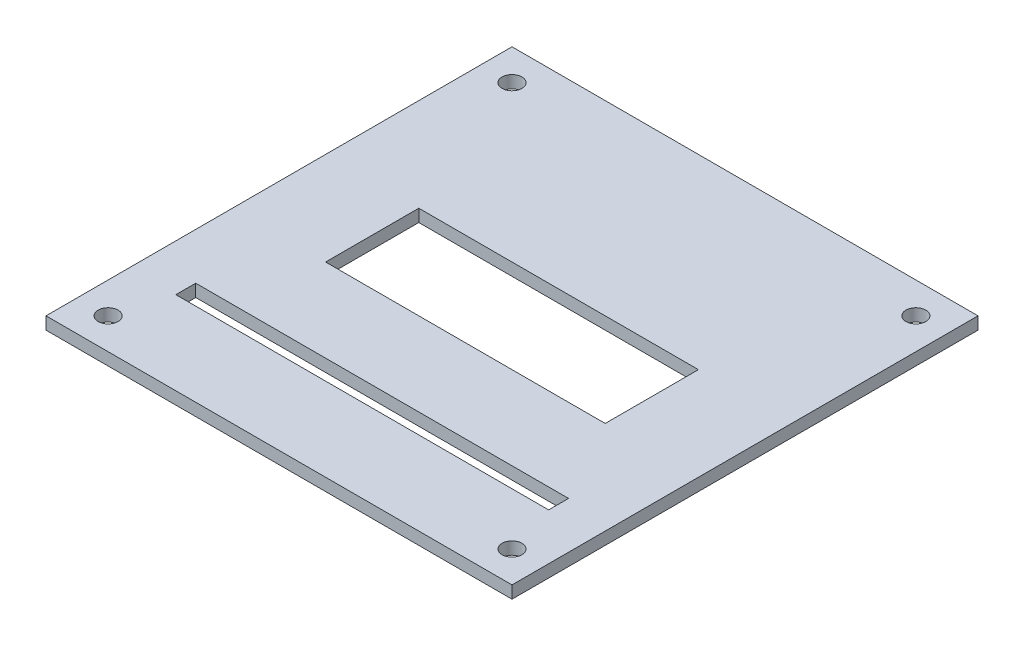
ISO-10303-21;
HEADER;
FILE_DESCRIPTION(('STEP AP214'),'2;1');
FILE_NAME('part.step','',(''),(''),'','','');
FILE_SCHEMA(('AUTOMOTIVE_DESIGN { 1 0 10303 214 1 1 1 1 }'));
ENDSEC;
DATA;
#1=APPLICATION_CONTEXT('core data for automotive mechanical design processes');
#2=APPLICATION_PROTOCOL_DEFINITION('international standard','automotive_design',2000,#1);
#3=PRODUCT_CONTEXT('',#1,'mechanical');
#4=PRODUCT('Part','Part','',(#3));
#5=PRODUCT_RELATED_PRODUCT_CATEGORY('part','',(#4));
#6=PRODUCT_DEFINITION_FORMATION('','',#4);
#7=PRODUCT_DEFINITION_CONTEXT('part definition',#1,'design');
#8=PRODUCT_DEFINITION('design','',#6,#7);
#9=PRODUCT_DEFINITION_SHAPE('','',#8);
#10=(LENGTH_UNIT() NAMED_UNIT(*) SI_UNIT(.MILLI.,.METRE.));
#11=(NAMED_UNIT(*) PLANE_ANGLE_UNIT() SI_UNIT($,.RADIAN.));
#12=(NAMED_UNIT(*) SI_UNIT($,.STERADIAN.) SOLID_ANGLE_UNIT());
#13=UNCERTAINTY_MEASURE_WITH_UNIT(LENGTH_MEASURE(1.E-05),#10,'distance_accuracy_value','');
#14=(GEOMETRIC_REPRESENTATION_CONTEXT(3) GLOBAL_UNCERTAINTY_ASSIGNED_CONTEXT((#13)) GLOBAL_UNIT_ASSIGNED_CONTEXT((#10,
#11,#12)) REPRESENTATION_CONTEXT('',''));
#15=CARTESIAN_POINT('',(0.,0.,0.));
#16=DIRECTION('',(0.,0.,1.));
#17=DIRECTION('',(1.,0.,0.));
#18=AXIS2_PLACEMENT_3D('',#15,#16,#17);
#19=CARTESIAN_POINT('',(0.,2.,0.));
#20=DIRECTION('',(0.,1.,0.));
#21=DIRECTION('',(0.,0.,1.));
#22=AXIS2_PLACEMENT_3D('',#19,#20,#21);
#23=PLANE('',#22);
#24=DIRECTION('',(0.,0.,-1.));
#25=VECTOR('',#24,1.);
#26=CARTESIAN_POINT('',(22.500000000041,2.,0.));
#27=LINE('',#26,#25);
#28=CARTESIAN_POINT('',(22.5000000000409,2.,7.5));
#29=VERTEX_POINT('',#28);
#30=CARTESIAN_POINT('',(22.500000000041,2.,-7.5));
#31=VERTEX_POINT('',#30);
#32=EDGE_CURVE('E218',#29,#31,#27,.T.);
#33=ORIENTED_EDGE('',*,*,#32,.F.);
#34=DIRECTION('',(1.,0.,0.));
#35=VECTOR('',#34,1.);
#36=CARTESIAN_POINT('',(0.,2.,7.5));
#37=LINE('',#36,#35);
#38=CARTESIAN_POINT('',(-22.500000000041,2.,7.5));
#39=VERTEX_POINT('',#38);
#40=EDGE_CURVE('E199',#39,#29,#37,.T.);
#41=ORIENTED_EDGE('',*,*,#40,.F.);
#42=DIRECTION('',(0.,0.,1.));
#43=VECTOR('',#42,1.);
#44=CARTESIAN_POINT('',(-22.500000000041,2.,0.));
#45=LINE('',#44,#43);
#46=CARTESIAN_POINT('',(-22.500000000041,2.,-7.5));
#47=VERTEX_POINT('',#46);
#48=EDGE_CURVE('E211',#47,#39,#45,.T.);
#49=ORIENTED_EDGE('',*,*,#48,.F.);
#50=DIRECTION('',(-1.,0.,0.));
#51=VECTOR('',#50,1.);
#52=CARTESIAN_POINT('',(0.,2.,-7.5));
#53=LINE('',#52,#51);
#54=EDGE_CURVE('E215',#31,#47,#53,.T.);
#55=ORIENTED_EDGE('',*,*,#54,.F.);
#56=EDGE_LOOP('',(#33,#41,#49,#55));
#57=FACE_BOUND('',#56,.T.);
#58=CARTESIAN_POINT('',(32.5,2.,32.5));
#59=DIRECTION('',(0.,1.,0.));
#60=DIRECTION('',(0.,0.,1.));
#61=AXIS2_PLACEMENT_3D('',#58,#59,#60);
#62=CIRCLE('',#61,1.60000000000001);
#63=CARTESIAN_POINT('',(32.5,2.,34.1));
#64=VERTEX_POINT('',#63);
#65=EDGE_CURVE('E222',#64,#64,#62,.T.);
#66=ORIENTED_EDGE('',*,*,#65,.F.);
#67=EDGE_LOOP('',(#66));
#68=FACE_BOUND('',#67,.T.);
#69=CARTESIAN_POINT('',(32.5,2.,-32.5));
#70=DIRECTION('',(0.,1.,0.));
#71=DIRECTION('',(0.,0.,1.));
#72=AXIS2_PLACEMENT_3D('',#69,#70,#71);
#73=CIRCLE('',#72,1.60000000000001);
#74=CARTESIAN_POINT('',(32.5,2.,-30.9));
#75=VERTEX_POINT('',#74);
#76=EDGE_CURVE('E226',#75,#75,#73,.T.);
#77=ORIENTED_EDGE('',*,*,#76,.F.);
#78=EDGE_LOOP('',(#77));
#79=FACE_BOUND('',#78,.T.);
#80=CARTESIAN_POINT('',(-32.5,2.,32.5));
#81=DIRECTION('',(0.,1.,0.));
#82=DIRECTION('',(0.,0.,1.));
#83=AXIS2_PLACEMENT_3D('',#80,#81,#82);
#84=CIRCLE('',#83,1.6);
#85=CARTESIAN_POINT('',(-32.5,2.,34.1));
#86=VERTEX_POINT('',#85);
#87=EDGE_CURVE('E231',#86,#86,#84,.T.);
#88=ORIENTED_EDGE('',*,*,#87,.F.);
#89=EDGE_LOOP('',(#88));
#90=FACE_BOUND('',#89,.T.);
#91=CARTESIAN_POINT('',(-32.5,2.,-32.5));
#92=DIRECTION('',(0.,1.,0.));
#93=DIRECTION('',(0.,0.,1.));
#94=AXIS2_PLACEMENT_3D('',#91,#92,#93);
#95=CIRCLE('',#94,1.6);
#96=CARTESIAN_POINT('',(-32.5,2.,-30.9));
#97=VERTEX_POINT('',#96);
#98=EDGE_CURVE('E235',#97,#97,#95,.T.);
#99=ORIENTED_EDGE('',*,*,#98,.F.);
#100=EDGE_LOOP('',(#99));
#101=FACE_BOUND('',#100,.T.);
#102=DIRECTION('',(1.,0.,0.));
#103=VECTOR('',#102,1.);
#104=CARTESIAN_POINT('',(0.,2.,-37.5));
#105=LINE('',#104,#103);
#106=CARTESIAN_POINT('',(-37.5,2.,-37.5));
#107=VERTEX_POINT('',#106);
#108=CARTESIAN_POINT('',(37.5,2.,-37.5));
#109=VERTEX_POINT('',#108);
#110=EDGE_CURVE('E239',#107,#109,#105,.T.);
#111=ORIENTED_EDGE('',*,*,#110,.F.);
#112=DIRECTION('',(0.,0.,1.));
#113=VECTOR('',#112,1.);
#114=CARTESIAN_POINT('',(-37.5,2.,0.));
#115=LINE('',#114,#113);
#116=CARTESIAN_POINT('',(-37.5,2.,37.5));
#117=VERTEX_POINT('',#116);
#118=EDGE_CURVE('E243',#107,#117,#115,.T.);
#119=ORIENTED_EDGE('',*,*,#118,.T.);
#120=DIRECTION('',(1.,0.,0.));
#121=VECTOR('',#120,1.);
#122=CARTESIAN_POINT('',(0.,2.,37.5));
#123=LINE('',#122,#121);
#124=CARTESIAN_POINT('',(37.5,2.,37.5));
#125=VERTEX_POINT('',#124);
#126=EDGE_CURVE('E247',#117,#125,#123,.T.);
#127=ORIENTED_EDGE('',*,*,#126,.T.);
#128=DIRECTION('',(0.,0.,1.));
#129=VECTOR('',#128,1.);
#130=CARTESIAN_POINT('',(37.5,2.,0.));
#131=LINE('',#130,#129);
#132=EDGE_CURVE('E250',#109,#125,#131,.T.);
#133=ORIENTED_EDGE('',*,*,#132,.F.);
#134=EDGE_LOOP('',(#111,#119,#127,#133));
#135=FACE_BOUND('',#134,.T.);
#136=DIRECTION('',(0.,0.,-1.));
#137=VECTOR('',#136,1.);
#138=CARTESIAN_POINT('',(30.,2.,0.));
#139=LINE('',#138,#137);
#140=CARTESIAN_POINT('',(30.,2.,24.1));
#141=VERTEX_POINT('',#140);
#142=CARTESIAN_POINT('',(30.,2.,20.9));
#143=VERTEX_POINT('',#142);
#144=EDGE_CURVE('E173',#141,#143,#139,.T.);
#145=ORIENTED_EDGE('',*,*,#144,.F.);
#146=DIRECTION('',(-1.,0.,0.));
#147=VECTOR('',#146,1.);
#148=CARTESIAN_POINT('',(0.,2.,24.1));
#149=LINE('',#148,#147);
#150=CARTESIAN_POINT('',(-30.,2.,24.1));
#151=VERTEX_POINT('',#150);
#152=EDGE_CURVE('E176',#141,#151,#149,.T.);
#153=ORIENTED_EDGE('',*,*,#152,.T.);
#154=DIRECTION('',(0.,0.,-1.));
#155=VECTOR('',#154,1.);
#156=CARTESIAN_POINT('',(-30.,2.,0.));
#157=LINE('',#156,#155);
#158=CARTESIAN_POINT('',(-30.,2.,20.9));
#159=VERTEX_POINT('',#158);
#160=EDGE_CURVE('E164',#151,#159,#157,.T.);
#161=ORIENTED_EDGE('',*,*,#160,.T.);
#162=DIRECTION('',(-1.,0.,0.));
#163=VECTOR('',#162,1.);
#164=CARTESIAN_POINT('',(0.,2.,20.9));
#165=LINE('',#164,#163);
#166=EDGE_CURVE('E140',#143,#159,#165,.T.);
#167=ORIENTED_EDGE('',*,*,#166,.F.);
#168=EDGE_LOOP('',(#145,#153,#161,#167));
#169=FACE_BOUND('',#168,.T.);
#170=ADVANCED_FACE('F45',(#57,#68,#79,#90,#101,#135,#169),#23,.T.);
#171=CARTESIAN_POINT('',(0.,0.,0.));
#172=DIRECTION('',(0.,1.,0.));
#173=DIRECTION('',(0.,0.,1.));
#174=AXIS2_PLACEMENT_3D('',#171,#172,#173);
#175=PLANE('',#174);
#176=DIRECTION('',(1.,0.,0.));
#177=VECTOR('',#176,1.);
#178=CARTESIAN_POINT('',(0.,0.,-37.5));
#179=LINE('',#178,#177);
#180=CARTESIAN_POINT('',(-37.5,0.,-37.5));
#181=VERTEX_POINT('',#180);
#182=CARTESIAN_POINT('',(37.5,0.,-37.5));
#183=VERTEX_POINT('',#182);
#184=EDGE_CURVE('E270',#181,#183,#179,.T.);
#185=ORIENTED_EDGE('',*,*,#184,.T.);
#186=DIRECTION('',(0.,0.,1.));
#187=VECTOR('',#186,1.);
#188=CARTESIAN_POINT('',(37.5,0.,0.));
#189=LINE('',#188,#187);
#190=CARTESIAN_POINT('',(37.5,0.,37.5));
#191=VERTEX_POINT('',#190);
#192=EDGE_CURVE('E227',#183,#191,#189,.T.);
#193=ORIENTED_EDGE('',*,*,#192,.T.);
#194=DIRECTION('',(1.,0.,0.));
#195=VECTOR('',#194,1.);
#196=CARTESIAN_POINT('',(0.,0.,37.5));
#197=LINE('',#196,#195);
#198=CARTESIAN_POINT('',(-37.5,0.,37.5));
#199=VERTEX_POINT('',#198);
#200=EDGE_CURVE('E278',#199,#191,#197,.T.);
#201=ORIENTED_EDGE('',*,*,#200,.F.);
#202=DIRECTION('',(0.,0.,1.));
#203=VECTOR('',#202,1.);
#204=CARTESIAN_POINT('',(-37.5,0.,0.));
#205=LINE('',#204,#203);
#206=EDGE_CURVE('E274',#181,#199,#205,.T.);
#207=ORIENTED_EDGE('',*,*,#206,.F.);
#208=EDGE_LOOP('',(#185,#193,#201,#207));
#209=FACE_BOUND('',#208,.T.);
#210=CARTESIAN_POINT('',(-32.5,0.,-32.5));
#211=DIRECTION('',(0.,1.,0.));
#212=DIRECTION('',(0.,0.,1.));
#213=AXIS2_PLACEMENT_3D('',#210,#211,#212);
#214=CIRCLE('',#213,1.6);
#215=CARTESIAN_POINT('',(-32.5,0.,-30.9));
#216=VERTEX_POINT('',#215);
#217=EDGE_CURVE('E266',#216,#216,#214,.T.);
#218=ORIENTED_EDGE('',*,*,#217,.T.);
#219=EDGE_LOOP('',(#218));
#220=FACE_BOUND('',#219,.T.);
#221=CARTESIAN_POINT('',(-32.5,0.,32.5));
#222=DIRECTION('',(0.,1.,0.));
#223=DIRECTION('',(0.,0.,1.));
#224=AXIS2_PLACEMENT_3D('',#221,#222,#223);
#225=CIRCLE('',#224,1.6);
#226=CARTESIAN_POINT('',(-32.5,0.,34.1));
#227=VERTEX_POINT('',#226);
#228=EDGE_CURVE('E262',#227,#227,#225,.T.);
#229=ORIENTED_EDGE('',*,*,#228,.T.);
#230=EDGE_LOOP('',(#229));
#231=FACE_BOUND('',#230,.T.);
#232=CARTESIAN_POINT('',(32.5,0.,-32.5));
#233=DIRECTION('',(0.,1.,0.));
#234=DIRECTION('',(0.,0.,1.));
#235=AXIS2_PLACEMENT_3D('',#232,#233,#234);
#236=CIRCLE('',#235,1.60000000000001);
#237=CARTESIAN_POINT('',(32.5,0.,-30.9));
#238=VERTEX_POINT('',#237);
#239=EDGE_CURVE('E258',#238,#238,#236,.T.);
#240=ORIENTED_EDGE('',*,*,#239,.T.);
#241=EDGE_LOOP('',(#240));
#242=FACE_BOUND('',#241,.T.);
#243=CARTESIAN_POINT('',(32.5,0.,32.5));
#244=DIRECTION('',(0.,1.,0.));
#245=DIRECTION('',(0.,0.,1.));
#246=AXIS2_PLACEMENT_3D('',#243,#244,#245);
#247=CIRCLE('',#246,1.60000000000001);
#248=CARTESIAN_POINT('',(32.5,0.,34.1));
#249=VERTEX_POINT('',#248);
#250=EDGE_CURVE('E221',#249,#249,#247,.T.);
#251=ORIENTED_EDGE('',*,*,#250,.T.);
#252=EDGE_LOOP('',(#251));
#253=FACE_BOUND('',#252,.T.);
#254=DIRECTION('',(-1.,0.,0.));
#255=VECTOR('',#254,1.);
#256=CARTESIAN_POINT('',(-22.500000000041,0.,7.5));
#257=LINE('',#256,#255);
#258=CARTESIAN_POINT('',(22.5000000000409,0.,7.5));
#259=VERTEX_POINT('',#258);
#260=CARTESIAN_POINT('',(-22.500000000041,0.,7.5));
#261=VERTEX_POINT('',#260);
#262=EDGE_CURVE('E183',#259,#261,#257,.T.);
#263=ORIENTED_EDGE('',*,*,#262,.F.);
#264=DIRECTION('',(0.,0.,1.));
#265=VECTOR('',#264,1.);
#266=CARTESIAN_POINT('',(22.5000000000409,0.,7.5));
#267=LINE('',#266,#265);
#268=CARTESIAN_POINT('',(22.500000000041,0.,-7.5));
#269=VERTEX_POINT('',#268);
#270=EDGE_CURVE('E180',#269,#259,#267,.T.);
#271=ORIENTED_EDGE('',*,*,#270,.F.);
#272=DIRECTION('',(1.,0.,0.));
#273=VECTOR('',#272,1.);
#274=CARTESIAN_POINT('',(-22.500000000041,0.,-7.5));
#275=LINE('',#274,#273);
#276=CARTESIAN_POINT('',(-22.500000000041,0.,-7.5));
#277=VERTEX_POINT('',#276);
#278=EDGE_CURVE('E191',#277,#269,#275,.T.);
#279=ORIENTED_EDGE('',*,*,#278,.F.);
#280=DIRECTION('',(0.,0.,-1.));
#281=VECTOR('',#280,1.);
#282=CARTESIAN_POINT('',(-22.500000000041,0.,7.5));
#283=LINE('',#282,#281);
#284=EDGE_CURVE('E187',#261,#277,#283,.T.);
#285=ORIENTED_EDGE('',*,*,#284,.F.);
#286=EDGE_LOOP('',(#263,#271,#279,#285));
#287=FACE_BOUND('',#286,.T.);
#288=DIRECTION('',(1.,0.,0.));
#289=VECTOR('',#288,1.);
#290=CARTESIAN_POINT('',(0.,0.,24.1));
#291=LINE('',#290,#289);
#292=CARTESIAN_POINT('',(-30.,0.,24.1));
#293=VERTEX_POINT('',#292);
#294=CARTESIAN_POINT('',(30.,0.,24.1));
#295=VERTEX_POINT('',#294);
#296=EDGE_CURVE('E69',#293,#295,#291,.T.);
#297=ORIENTED_EDGE('',*,*,#296,.T.);
#298=DIRECTION('',(0.,0.,1.));
#299=VECTOR('',#298,1.);
#300=CARTESIAN_POINT('',(30.,0.,0.));
#301=LINE('',#300,#299);
#302=CARTESIAN_POINT('',(30.,0.,20.9));
#303=VERTEX_POINT('',#302);
#304=EDGE_CURVE('E154',#303,#295,#301,.T.);
#305=ORIENTED_EDGE('',*,*,#304,.F.);
#306=DIRECTION('',(1.,0.,0.));
#307=VECTOR('',#306,1.);
#308=CARTESIAN_POINT('',(0.,0.,20.9));
#309=LINE('',#308,#307);
#310=CARTESIAN_POINT('',(-30.,0.,20.9));
#311=VERTEX_POINT('',#310);
#312=EDGE_CURVE('E137',#311,#303,#309,.T.);
#313=ORIENTED_EDGE('',*,*,#312,.F.);
#314=DIRECTION('',(0.,0.,1.));
#315=VECTOR('',#314,1.);
#316=CARTESIAN_POINT('',(-30.,0.,0.));
#317=LINE('',#316,#315);
#318=EDGE_CURVE('E147',#311,#293,#317,.T.);
#319=ORIENTED_EDGE('',*,*,#318,.T.);
#320=EDGE_LOOP('',(#297,#305,#313,#319));
#321=FACE_BOUND('',#320,.T.);
#322=ADVANCED_FACE('F152',(#209,#220,#231,#242,#253,#287,#321),#175,.F.);
#323=CARTESIAN_POINT('',(0.,2.,-37.5));
#324=DIRECTION('',(0.,0.,-1.));
#325=DIRECTION('',(-1.,0.,0.));
#326=AXIS2_PLACEMENT_3D('',#323,#324,#325);
#327=PLANE('',#326);
#328=ORIENTED_EDGE('',*,*,#184,.F.);
#329=DIRECTION('',(0.,-1.,0.));
#330=VECTOR('',#329,1.);
#331=CARTESIAN_POINT('',(-37.5,2.,-37.5));
#332=LINE('',#331,#330);
#333=EDGE_CURVE('E11',#107,#181,#332,.T.);
#334=ORIENTED_EDGE('',*,*,#333,.F.);
#335=ORIENTED_EDGE('',*,*,#110,.T.);
#336=DIRECTION('',(0.,-1.,0.));
#337=VECTOR('',#336,1.);
#338=CARTESIAN_POINT('',(37.5,2.,-37.5));
#339=LINE('',#338,#337);
#340=EDGE_CURVE('E254',#109,#183,#339,.T.);
#341=ORIENTED_EDGE('',*,*,#340,.T.);
#342=EDGE_LOOP('',(#328,#334,#335,#341));
#343=FACE_BOUND('',#342,.T.);
#344=ADVANCED_FACE('F304',(#343),#327,.T.);
#345=CARTESIAN_POINT('',(-37.5,2.,0.));
#346=DIRECTION('',(1.,0.,0.));
#347=DIRECTION('',(0.,0.,-1.));
#348=AXIS2_PLACEMENT_3D('',#345,#346,#347);
#349=PLANE('',#348);
#350=ORIENTED_EDGE('',*,*,#206,.T.);
#351=DIRECTION('',(0.,-1.,0.));
#352=VECTOR('',#351,1.);
#353=CARTESIAN_POINT('',(-37.5,2.,37.5));
#354=LINE('',#353,#352);
#355=EDGE_CURVE('E54',#117,#199,#354,.T.);
#356=ORIENTED_EDGE('',*,*,#355,.F.);
#357=ORIENTED_EDGE('',*,*,#118,.F.);
#358=ORIENTED_EDGE('',*,*,#333,.T.);
#359=EDGE_LOOP('',(#350,#356,#357,#358));
#360=FACE_BOUND('',#359,.T.);
#361=ADVANCED_FACE('F298',(#360),#349,.F.);
#362=CARTESIAN_POINT('',(0.,2.,37.5));
#363=DIRECTION('',(0.,0.,-1.));
#364=DIRECTION('',(-1.,0.,0.));
#365=AXIS2_PLACEMENT_3D('',#362,#363,#364);
#366=PLANE('',#365);
#367=ORIENTED_EDGE('',*,*,#200,.T.);
#368=DIRECTION('',(0.,-1.,0.));
#369=VECTOR('',#368,1.);
#370=CARTESIAN_POINT('',(37.5,2.,37.5));
#371=LINE('',#370,#369);
#372=EDGE_CURVE('E287',#125,#191,#371,.T.);
#373=ORIENTED_EDGE('',*,*,#372,.F.);
#374=ORIENTED_EDGE('',*,*,#126,.F.);
#375=ORIENTED_EDGE('',*,*,#355,.T.);
#376=EDGE_LOOP('',(#367,#373,#374,#375));
#377=FACE_BOUND('',#376,.T.);
#378=ADVANCED_FACE('F293',(#377),#366,.F.);
#379=CARTESIAN_POINT('',(-32.5,2.,-32.5));
#380=DIRECTION('',(0.,-1.,0.));
#381=DIRECTION('',(0.,0.,-1.));
#382=AXIS2_PLACEMENT_3D('',#379,#380,#381);
#383=CYLINDRICAL_SURFACE('',#382,1.6);
#384=ORIENTED_EDGE('',*,*,#98,.T.);
#385=EDGE_LOOP('',(#384));
#386=FACE_BOUND('',#385,.T.);
#387=ORIENTED_EDGE('',*,*,#217,.F.);
#388=EDGE_LOOP('',(#387));
#389=FACE_BOUND('',#388,.T.);
#390=ADVANCED_FACE('F350',(#386,#389),#383,.F.);
#391=CARTESIAN_POINT('',(-32.5,2.,32.5));
#392=DIRECTION('',(0.,-1.,0.));
#393=DIRECTION('',(0.,0.,-1.));
#394=AXIS2_PLACEMENT_3D('',#391,#392,#393);
#395=CYLINDRICAL_SURFACE('',#394,1.6);
#396=ORIENTED_EDGE('',*,*,#87,.T.);
#397=EDGE_LOOP('',(#396));
#398=FACE_BOUND('',#397,.T.);
#399=ORIENTED_EDGE('',*,*,#228,.F.);
#400=EDGE_LOOP('',(#399));
#401=FACE_BOUND('',#400,.T.);
#402=ADVANCED_FACE('F357',(#398,#401),#395,.F.);
#403=CARTESIAN_POINT('',(32.5,2.,-32.5));
#404=DIRECTION('',(0.,-1.,0.));
#405=DIRECTION('',(0.,0.,-1.));
#406=AXIS2_PLACEMENT_3D('',#403,#404,#405);
#407=CYLINDRICAL_SURFACE('',#406,1.60000000000001);
#408=ORIENTED_EDGE('',*,*,#76,.T.);
#409=EDGE_LOOP('',(#408));
#410=FACE_BOUND('',#409,.T.);
#411=ORIENTED_EDGE('',*,*,#239,.F.);
#412=EDGE_LOOP('',(#411));
#413=FACE_BOUND('',#412,.T.);
#414=ADVANCED_FACE('F360',(#410,#413),#407,.F.);
#415=CARTESIAN_POINT('',(32.5,2.,32.5));
#416=DIRECTION('',(0.,-1.,0.));
#417=DIRECTION('',(0.,0.,-1.));
#418=AXIS2_PLACEMENT_3D('',#415,#416,#417);
#419=CYLINDRICAL_SURFACE('',#418,1.60000000000001);
#420=ORIENTED_EDGE('',*,*,#65,.T.);
#421=EDGE_LOOP('',(#420));
#422=FACE_BOUND('',#421,.T.);
#423=ORIENTED_EDGE('',*,*,#250,.F.);
#424=EDGE_LOOP('',(#423));
#425=FACE_BOUND('',#424,.T.);
#426=ADVANCED_FACE('F47',(#422,#425),#419,.F.);
#427=CARTESIAN_POINT('',(37.5,2.,0.));
#428=DIRECTION('',(1.,0.,0.));
#429=DIRECTION('',(0.,0.,-1.));
#430=AXIS2_PLACEMENT_3D('',#427,#428,#429);
#431=PLANE('',#430);
#432=ORIENTED_EDGE('',*,*,#192,.F.);
#433=ORIENTED_EDGE('',*,*,#340,.F.);
#434=ORIENTED_EDGE('',*,*,#132,.T.);
#435=ORIENTED_EDGE('',*,*,#372,.T.);
#436=EDGE_LOOP('',(#432,#433,#434,#435));
#437=FACE_BOUND('',#436,.T.);
#438=ADVANCED_FACE('F308',(#437),#431,.T.);
#439=CARTESIAN_POINT('',(22.5000000000409,10.,7.5));
#440=DIRECTION('',(1.,0.,0.));
#441=DIRECTION('',(0.,0.,-1.));
#442=AXIS2_PLACEMENT_3D('',#439,#440,#441);
#443=PLANE('',#442);
#444=ORIENTED_EDGE('',*,*,#32,.T.);
#445=DIRECTION('',(0.,-1.,0.));
#446=VECTOR('',#445,1.);
#447=CARTESIAN_POINT('',(22.500000000041,10.,-7.5));
#448=LINE('',#447,#446);
#449=EDGE_CURVE('E196',#31,#269,#448,.T.);
#450=ORIENTED_EDGE('',*,*,#449,.T.);
#451=ORIENTED_EDGE('',*,*,#270,.T.);
#452=DIRECTION('',(0.,-1.,0.));
#453=VECTOR('',#452,1.);
#454=CARTESIAN_POINT('',(22.5000000000409,10.,7.5));
#455=LINE('',#454,#453);
#456=EDGE_CURVE('E195',#29,#259,#455,.T.);
#457=ORIENTED_EDGE('',*,*,#456,.F.);
#458=EDGE_LOOP('',(#444,#450,#451,#457));
#459=FACE_BOUND('',#458,.T.);
#460=ADVANCED_FACE('F336',(#459),#443,.F.);
#461=CARTESIAN_POINT('',(-22.500000000041,10.,-7.5));
#462=DIRECTION('',(0.,0.,-1.));
#463=DIRECTION('',(-1.,0.,0.));
#464=AXIS2_PLACEMENT_3D('',#461,#462,#463);
#465=PLANE('',#464);
#466=ORIENTED_EDGE('',*,*,#54,.T.);
#467=DIRECTION('',(0.,-1.,0.));
#468=VECTOR('',#467,1.);
#469=CARTESIAN_POINT('',(-22.500000000041,10.,-7.5));
#470=LINE('',#469,#468);
#471=EDGE_CURVE('E200',#47,#277,#470,.T.);
#472=ORIENTED_EDGE('',*,*,#471,.T.);
#473=ORIENTED_EDGE('',*,*,#278,.T.);
#474=ORIENTED_EDGE('',*,*,#449,.F.);
#475=EDGE_LOOP('',(#466,#472,#473,#474));
#476=FACE_BOUND('',#475,.T.);
#477=ADVANCED_FACE('F333',(#476),#465,.F.);
#478=CARTESIAN_POINT('',(-22.500000000041,10.,7.5));
#479=DIRECTION('',(-1.,0.,0.));
#480=DIRECTION('',(0.,0.,1.));
#481=AXIS2_PLACEMENT_3D('',#478,#479,#480);
#482=PLANE('',#481);
#483=ORIENTED_EDGE('',*,*,#48,.T.);
#484=DIRECTION('',(0.,-1.,0.));
#485=VECTOR('',#484,1.);
#486=CARTESIAN_POINT('',(-22.500000000041,10.,7.5));
#487=LINE('',#486,#485);
#488=EDGE_CURVE('E203',#39,#261,#487,.T.);
#489=ORIENTED_EDGE('',*,*,#488,.T.);
#490=ORIENTED_EDGE('',*,*,#284,.T.);
#491=ORIENTED_EDGE('',*,*,#471,.F.);
#492=EDGE_LOOP('',(#483,#489,#490,#491));
#493=FACE_BOUND('',#492,.T.);
#494=ADVANCED_FACE('F327',(#493),#482,.F.);
#495=CARTESIAN_POINT('',(-22.500000000041,10.,7.5));
#496=DIRECTION('',(0.,0.,1.));
#497=DIRECTION('',(1.,0.,0.));
#498=AXIS2_PLACEMENT_3D('',#495,#496,#497);
#499=PLANE('',#498);
#500=ORIENTED_EDGE('',*,*,#40,.T.);
#501=ORIENTED_EDGE('',*,*,#456,.T.);
#502=ORIENTED_EDGE('',*,*,#262,.T.);
#503=ORIENTED_EDGE('',*,*,#488,.F.);
#504=EDGE_LOOP('',(#500,#501,#502,#503));
#505=FACE_BOUND('',#504,.T.);
#506=ADVANCED_FACE('F320',(#505),#499,.F.);
#507=CARTESIAN_POINT('',(0.,10.,24.1));
#508=DIRECTION('',(0.,0.,-1.));
#509=DIRECTION('',(-1.,0.,0.));
#510=AXIS2_PLACEMENT_3D('',#507,#508,#509);
#511=PLANE('',#510);
#512=DIRECTION('',(0.,-1.,0.));
#513=VECTOR('',#512,1.);
#514=CARTESIAN_POINT('',(30.,10.,24.1));
#515=LINE('',#514,#513);
#516=EDGE_CURVE('E161',#141,#295,#515,.T.);
#517=ORIENTED_EDGE('',*,*,#516,.T.);
#518=ORIENTED_EDGE('',*,*,#296,.F.);
#519=DIRECTION('',(0.,-1.,0.));
#520=VECTOR('',#519,1.);
#521=CARTESIAN_POINT('',(-30.,10.,24.1));
#522=LINE('',#521,#520);
#523=EDGE_CURVE('E144',#151,#293,#522,.T.);
#524=ORIENTED_EDGE('',*,*,#523,.F.);
#525=ORIENTED_EDGE('',*,*,#152,.F.);
#526=EDGE_LOOP('',(#517,#518,#524,#525));
#527=FACE_BOUND('',#526,.T.);
#528=ADVANCED_FACE('F318',(#527),#511,.T.);
#529=CARTESIAN_POINT('',(30.,10.,0.));
#530=DIRECTION('',(1.,0.,0.));
#531=DIRECTION('',(0.,0.,-1.));
#532=AXIS2_PLACEMENT_3D('',#529,#530,#531);
#533=PLANE('',#532);
#534=ORIENTED_EDGE('',*,*,#144,.T.);
#535=DIRECTION('',(0.,-1.,0.));
#536=VECTOR('',#535,1.);
#537=CARTESIAN_POINT('',(30.,10.,20.9));
#538=LINE('',#537,#536);
#539=EDGE_CURVE('E143',#143,#303,#538,.T.);
#540=ORIENTED_EDGE('',*,*,#539,.T.);
#541=ORIENTED_EDGE('',*,*,#304,.T.);
#542=ORIENTED_EDGE('',*,*,#516,.F.);
#543=EDGE_LOOP('',(#534,#540,#541,#542));
#544=FACE_BOUND('',#543,.T.);
#545=ADVANCED_FACE('F317',(#544),#533,.F.);
#546=CARTESIAN_POINT('',(0.,10.,20.9));
#547=DIRECTION('',(0.,0.,-1.));
#548=DIRECTION('',(-1.,0.,0.));
#549=AXIS2_PLACEMENT_3D('',#546,#547,#548);
#550=PLANE('',#549);
#551=ORIENTED_EDGE('',*,*,#166,.T.);
#552=DIRECTION('',(0.,-1.,0.));
#553=VECTOR('',#552,1.);
#554=CARTESIAN_POINT('',(-30.,10.,20.9));
#555=LINE('',#554,#553);
#556=EDGE_CURVE('E61',#159,#311,#555,.T.);
#557=ORIENTED_EDGE('',*,*,#556,.T.);
#558=ORIENTED_EDGE('',*,*,#312,.T.);
#559=ORIENTED_EDGE('',*,*,#539,.F.);
#560=EDGE_LOOP('',(#551,#557,#558,#559));
#561=FACE_BOUND('',#560,.T.);
#562=ADVANCED_FACE('F134',(#561),#550,.F.);
#563=CARTESIAN_POINT('',(-30.,10.,0.));
#564=DIRECTION('',(1.,0.,0.));
#565=DIRECTION('',(0.,0.,-1.));
#566=AXIS2_PLACEMENT_3D('',#563,#564,#565);
#567=PLANE('',#566);
#568=ORIENTED_EDGE('',*,*,#523,.T.);
#569=ORIENTED_EDGE('',*,*,#318,.F.);
#570=ORIENTED_EDGE('',*,*,#556,.F.);
#571=ORIENTED_EDGE('',*,*,#160,.F.);
#572=EDGE_LOOP('',(#568,#569,#570,#571));
#573=FACE_BOUND('',#572,.T.);
#574=ADVANCED_FACE('F148',(#573),#567,.T.);
#575=CLOSED_SHELL('',(#170,#322,#344,#361,#378,#390,#402,#414,#426,#438,#460,#477,#494,#506,
#528,#545,#562,#574));
#576=MANIFOLD_SOLID_BREP('B2',#575);
#577=ADVANCED_BREP_SHAPE_REPRESENTATION('',(#18,#576),#14);
#578=SHAPE_DEFINITION_REPRESENTATION(#9,#577);
ENDSEC;
END-ISO-10303-21;
